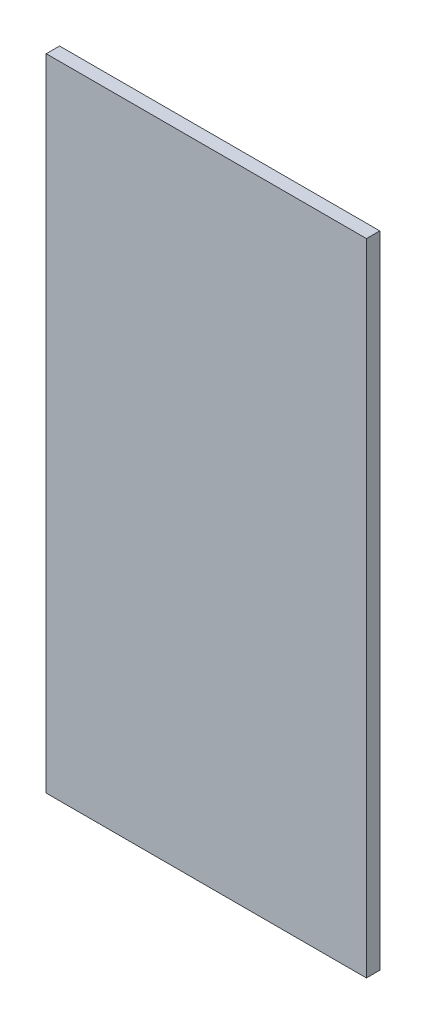
ISO-10303-21;
HEADER;
FILE_DESCRIPTION(('STEP AP214'),'2;1');
FILE_NAME('part.step','',(''),(''),'','','');
FILE_SCHEMA(('AUTOMOTIVE_DESIGN { 1 0 10303 214 1 1 1 1 }'));
ENDSEC;
DATA;
#1=APPLICATION_CONTEXT('core data for automotive mechanical design processes');
#2=APPLICATION_PROTOCOL_DEFINITION('international standard','automotive_design',2000,#1);
#3=PRODUCT_CONTEXT('',#1,'mechanical');
#4=PRODUCT('Part','Part','',(#3));
#5=PRODUCT_RELATED_PRODUCT_CATEGORY('part','',(#4));
#6=PRODUCT_DEFINITION_FORMATION('','',#4);
#7=PRODUCT_DEFINITION_CONTEXT('part definition',#1,'design');
#8=PRODUCT_DEFINITION('design','',#6,#7);
#9=PRODUCT_DEFINITION_SHAPE('','',#8);
#10=(LENGTH_UNIT() NAMED_UNIT(*) SI_UNIT(.MILLI.,.METRE.));
#11=(NAMED_UNIT(*) PLANE_ANGLE_UNIT() SI_UNIT($,.RADIAN.));
#12=(NAMED_UNIT(*) SI_UNIT($,.STERADIAN.) SOLID_ANGLE_UNIT());
#13=UNCERTAINTY_MEASURE_WITH_UNIT(LENGTH_MEASURE(1.E-05),#10,'distance_accuracy_value','');
#14=(GEOMETRIC_REPRESENTATION_CONTEXT(3) GLOBAL_UNCERTAINTY_ASSIGNED_CONTEXT((#13)) GLOBAL_UNIT_ASSIGNED_CONTEXT((#10,
#11,#12)) REPRESENTATION_CONTEXT('',''));
#15=CARTESIAN_POINT('',(0.,0.,0.));
#16=DIRECTION('',(0.,0.,1.));
#17=DIRECTION('',(1.,0.,0.));
#18=AXIS2_PLACEMENT_3D('',#15,#16,#17);
#19=CARTESIAN_POINT('',(-152.4,304.8,6.35));
#20=DIRECTION('',(0.,1.,0.));
#21=DIRECTION('',(0.,0.,1.));
#22=AXIS2_PLACEMENT_3D('',#19,#20,#21);
#23=PLANE('',#22);
#24=DIRECTION('',(1.,0.,0.));
#25=VECTOR('',#24,1.);
#26=CARTESIAN_POINT('',(-152.4,304.8,-6.35));
#27=LINE('',#26,#25);
#28=CARTESIAN_POINT('',(-152.4,304.8,-6.35));
#29=VERTEX_POINT('',#28);
#30=CARTESIAN_POINT('',(152.4,304.8,-6.35));
#31=VERTEX_POINT('',#30);
#32=EDGE_CURVE('E116',#29,#31,#27,.T.);
#33=ORIENTED_EDGE('',*,*,#32,.F.);
#34=DIRECTION('',(0.,0.,-1.));
#35=VECTOR('',#34,1.);
#36=CARTESIAN_POINT('',(-152.4,304.8,6.35));
#37=LINE('',#36,#35);
#38=CARTESIAN_POINT('',(-152.4,304.8,6.35));
#39=VERTEX_POINT('',#38);
#40=EDGE_CURVE('E11',#39,#29,#37,.T.);
#41=ORIENTED_EDGE('',*,*,#40,.F.);
#42=DIRECTION('',(1.,0.,0.));
#43=VECTOR('',#42,1.);
#44=CARTESIAN_POINT('',(-152.4,304.8,6.35));
#45=LINE('',#44,#43);
#46=CARTESIAN_POINT('',(152.4,304.8,6.35));
#47=VERTEX_POINT('',#46);
#48=EDGE_CURVE('E109',#39,#47,#45,.T.);
#49=ORIENTED_EDGE('',*,*,#48,.T.);
#50=DIRECTION('',(0.,0.,-1.));
#51=VECTOR('',#50,1.);
#52=CARTESIAN_POINT('',(152.4,304.8,6.35));
#53=LINE('',#52,#51);
#54=EDGE_CURVE('E48',#47,#31,#53,.T.);
#55=ORIENTED_EDGE('',*,*,#54,.T.);
#56=EDGE_LOOP('',(#33,#41,#49,#55));
#57=FACE_BOUND('',#56,.T.);
#58=ADVANCED_FACE('F45',(#57),#23,.T.);
#59=CARTESIAN_POINT('',(-152.4,304.8,6.35));
#60=DIRECTION('',(1.,0.,0.));
#61=DIRECTION('',(0.,0.,-1.));
#62=AXIS2_PLACEMENT_3D('',#59,#60,#61);
#63=PLANE('',#62);
#64=DIRECTION('',(0.,-1.,0.));
#65=VECTOR('',#64,1.);
#66=CARTESIAN_POINT('',(-152.4,304.8,-6.35));
#67=LINE('',#66,#65);
#68=CARTESIAN_POINT('',(-152.4,-304.8,-6.35));
#69=VERTEX_POINT('',#68);
#70=EDGE_CURVE('E79',#29,#69,#67,.T.);
#71=ORIENTED_EDGE('',*,*,#70,.T.);
#72=DIRECTION('',(0.,0.,-1.));
#73=VECTOR('',#72,1.);
#74=CARTESIAN_POINT('',(-152.4,-304.8,6.35));
#75=LINE('',#74,#73);
#76=CARTESIAN_POINT('',(-152.4,-304.8,6.35));
#77=VERTEX_POINT('',#76);
#78=EDGE_CURVE('E55',#77,#69,#75,.T.);
#79=ORIENTED_EDGE('',*,*,#78,.F.);
#80=DIRECTION('',(0.,-1.,0.));
#81=VECTOR('',#80,1.);
#82=CARTESIAN_POINT('',(-152.4,304.8,6.35));
#83=LINE('',#82,#81);
#84=EDGE_CURVE('E96',#39,#77,#83,.T.);
#85=ORIENTED_EDGE('',*,*,#84,.F.);
#86=ORIENTED_EDGE('',*,*,#40,.T.);
#87=EDGE_LOOP('',(#71,#79,#85,#86));
#88=FACE_BOUND('',#87,.T.);
#89=ADVANCED_FACE('F132',(#88),#63,.F.);
#90=CARTESIAN_POINT('',(-152.4,-304.8,6.35));
#91=DIRECTION('',(0.,1.,0.));
#92=DIRECTION('',(0.,0.,1.));
#93=AXIS2_PLACEMENT_3D('',#90,#91,#92);
#94=PLANE('',#93);
#95=DIRECTION('',(1.,0.,0.));
#96=VECTOR('',#95,1.);
#97=CARTESIAN_POINT('',(-152.4,-304.8,-6.35));
#98=LINE('',#97,#96);
#99=CARTESIAN_POINT('',(152.4,-304.8,-6.35));
#100=VERTEX_POINT('',#99);
#101=EDGE_CURVE('E104',#69,#100,#98,.T.);
#102=ORIENTED_EDGE('',*,*,#101,.T.);
#103=DIRECTION('',(0.,0.,-1.));
#104=VECTOR('',#103,1.);
#105=CARTESIAN_POINT('',(152.4,-304.8,6.35));
#106=LINE('',#105,#104);
#107=CARTESIAN_POINT('',(152.4,-304.8,6.35));
#108=VERTEX_POINT('',#107);
#109=EDGE_CURVE('E101',#108,#100,#106,.T.);
#110=ORIENTED_EDGE('',*,*,#109,.F.);
#111=DIRECTION('',(1.,0.,0.));
#112=VECTOR('',#111,1.);
#113=CARTESIAN_POINT('',(-152.4,-304.8,6.35));
#114=LINE('',#113,#112);
#115=EDGE_CURVE('E91',#77,#108,#114,.T.);
#116=ORIENTED_EDGE('',*,*,#115,.F.);
#117=ORIENTED_EDGE('',*,*,#78,.T.);
#118=EDGE_LOOP('',(#102,#110,#116,#117));
#119=FACE_BOUND('',#118,.T.);
#120=ADVANCED_FACE('F102',(#119),#94,.F.);
#121=CARTESIAN_POINT('',(152.4,304.8,6.35));
#122=DIRECTION('',(1.,0.,0.));
#123=DIRECTION('',(0.,0.,-1.));
#124=AXIS2_PLACEMENT_3D('',#121,#122,#123);
#125=PLANE('',#124);
#126=DIRECTION('',(0.,-1.,0.));
#127=VECTOR('',#126,1.);
#128=CARTESIAN_POINT('',(152.4,304.8,-6.35));
#129=LINE('',#128,#127);
#130=EDGE_CURVE('E120',#31,#100,#129,.T.);
#131=ORIENTED_EDGE('',*,*,#130,.F.);
#132=ORIENTED_EDGE('',*,*,#54,.F.);
#133=DIRECTION('',(0.,-1.,0.));
#134=VECTOR('',#133,1.);
#135=CARTESIAN_POINT('',(152.4,304.8,6.35));
#136=LINE('',#135,#134);
#137=EDGE_CURVE('E95',#47,#108,#136,.T.);
#138=ORIENTED_EDGE('',*,*,#137,.T.);
#139=ORIENTED_EDGE('',*,*,#109,.T.);
#140=EDGE_LOOP('',(#131,#132,#138,#139));
#141=FACE_BOUND('',#140,.T.);
#142=ADVANCED_FACE('F107',(#141),#125,.T.);
#143=CARTESIAN_POINT('',(0.,0.,6.35));
#144=DIRECTION('',(0.,0.,-1.));
#145=DIRECTION('',(-1.,0.,0.));
#146=AXIS2_PLACEMENT_3D('',#143,#144,#145);
#147=PLANE('',#146);
#148=ORIENTED_EDGE('',*,*,#48,.F.);
#149=ORIENTED_EDGE('',*,*,#84,.T.);
#150=ORIENTED_EDGE('',*,*,#115,.T.);
#151=ORIENTED_EDGE('',*,*,#137,.F.);
#152=EDGE_LOOP('',(#148,#149,#150,#151));
#153=FACE_BOUND('',#152,.T.);
#154=ADVANCED_FACE('F94',(#153),#147,.F.);
#155=CARTESIAN_POINT('',(0.,0.,-6.35));
#156=DIRECTION('',(0.,0.,-1.));
#157=DIRECTION('',(-1.,0.,0.));
#158=AXIS2_PLACEMENT_3D('',#155,#156,#157);
#159=PLANE('',#158);
#160=ORIENTED_EDGE('',*,*,#32,.T.);
#161=ORIENTED_EDGE('',*,*,#130,.T.);
#162=ORIENTED_EDGE('',*,*,#101,.F.);
#163=ORIENTED_EDGE('',*,*,#70,.F.);
#164=EDGE_LOOP('',(#160,#161,#162,#163));
#165=FACE_BOUND('',#164,.T.);
#166=ADVANCED_FACE('F129',(#165),#159,.T.);
#167=CLOSED_SHELL('',(#58,#89,#120,#142,#154,#166));
#168=MANIFOLD_SOLID_BREP('B2',#167);
#169=ADVANCED_BREP_SHAPE_REPRESENTATION('',(#18,#168),#14);
#170=SHAPE_DEFINITION_REPRESENTATION(#9,#169);
ENDSEC;
END-ISO-10303-21;
